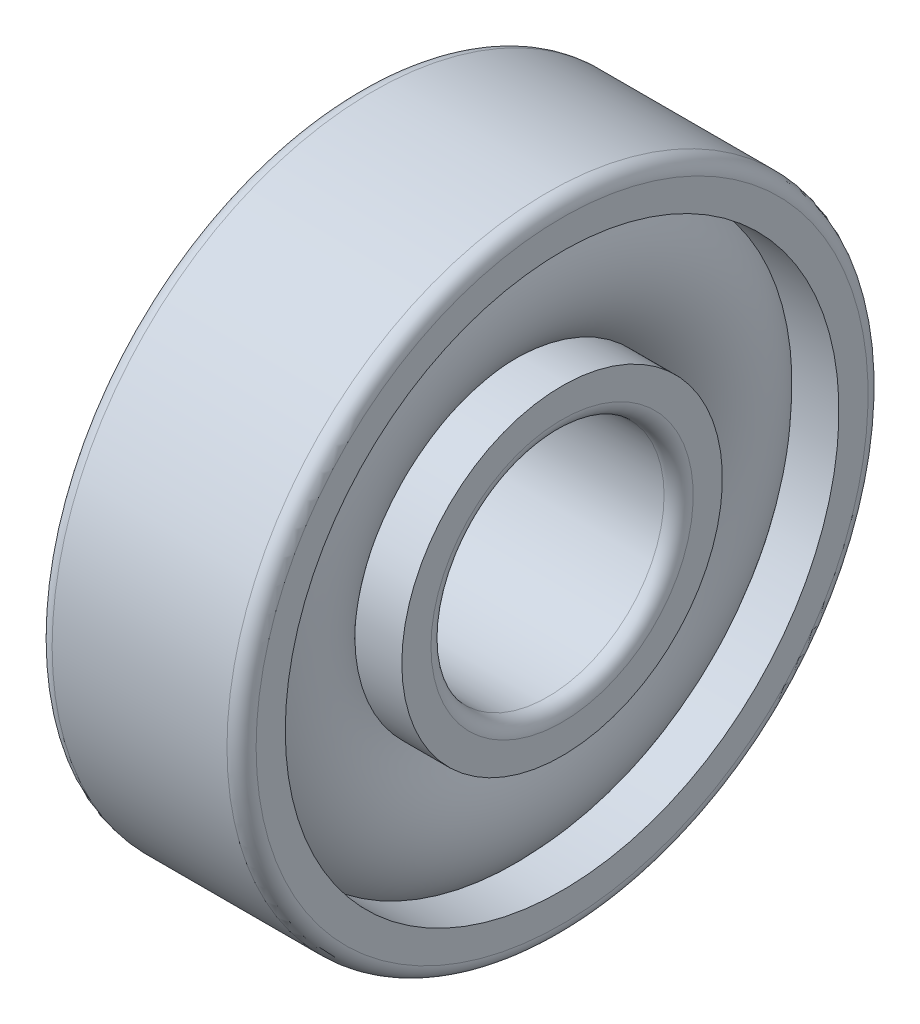
ISO-10303-21;
HEADER;
FILE_DESCRIPTION(('STEP AP214'),'2;1');
FILE_NAME('part.step','',(''),(''),'','','');
FILE_SCHEMA(('AUTOMOTIVE_DESIGN { 1 0 10303 214 1 1 1 1 }'));
ENDSEC;
DATA;
#1=APPLICATION_CONTEXT('core data for automotive mechanical design processes');
#2=APPLICATION_PROTOCOL_DEFINITION('international standard','automotive_design',2000,#1);
#3=PRODUCT_CONTEXT('',#1,'mechanical');
#4=PRODUCT('Part','Part','',(#3));
#5=PRODUCT_RELATED_PRODUCT_CATEGORY('part','',(#4));
#6=PRODUCT_DEFINITION_FORMATION('','',#4);
#7=PRODUCT_DEFINITION_CONTEXT('part definition',#1,'design');
#8=PRODUCT_DEFINITION('design','',#6,#7);
#9=PRODUCT_DEFINITION_SHAPE('','',#8);
#10=(LENGTH_UNIT() NAMED_UNIT(*) SI_UNIT(.MILLI.,.METRE.));
#11=(NAMED_UNIT(*) PLANE_ANGLE_UNIT() SI_UNIT($,.RADIAN.));
#12=(NAMED_UNIT(*) SI_UNIT($,.STERADIAN.) SOLID_ANGLE_UNIT());
#13=UNCERTAINTY_MEASURE_WITH_UNIT(LENGTH_MEASURE(1.E-05),#10,'distance_accuracy_value','');
#14=(GEOMETRIC_REPRESENTATION_CONTEXT(3) GLOBAL_UNCERTAINTY_ASSIGNED_CONTEXT((#13)) GLOBAL_UNIT_ASSIGNED_CONTEXT((#10,
#11,#12)) REPRESENTATION_CONTEXT('',''));
#15=CARTESIAN_POINT('',(0.,0.,0.));
#16=DIRECTION('',(0.,0.,1.));
#17=DIRECTION('',(1.,0.,0.));
#18=AXIS2_PLACEMENT_3D('',#15,#16,#17);
#19=CARTESIAN_POINT('',(0.,0.,0.));
#20=DIRECTION('',(-1.,0.,0.));
#21=DIRECTION('',(0.,0.,1.));
#22=AXIS2_PLACEMENT_3D('',#19,#20,#21);
#23=CYLINDRICAL_SURFACE('',#22,9.5);
#24=CARTESIAN_POINT('',(-1.88745860881769,0.,0.));
#25=DIRECTION('',(-1.,0.,0.));
#26=DIRECTION('',(0.,0.,1.));
#27=AXIS2_PLACEMENT_3D('',#24,#25,#26);
#28=CIRCLE('',#27,9.5);
#29=CARTESIAN_POINT('',(-1.88745860881769,0.,9.5));
#30=VERTEX_POINT('',#29);
#31=EDGE_CURVE('E66',#30,#30,#28,.T.);
#32=ORIENTED_EDGE('',*,*,#31,.F.);
#33=EDGE_LOOP('',(#32));
#34=FACE_BOUND('',#33,.T.);
#35=CARTESIAN_POINT('',(-3.5,0.,0.));
#36=DIRECTION('',(-1.,0.,0.));
#37=DIRECTION('',(0.,0.,1.));
#38=AXIS2_PLACEMENT_3D('',#35,#36,#37);
#39=CIRCLE('',#38,9.5);
#40=CARTESIAN_POINT('',(-3.5,0.,9.5));
#41=VERTEX_POINT('',#40);
#42=EDGE_CURVE('E87',#41,#41,#39,.T.);
#43=ORIENTED_EDGE('',*,*,#42,.T.);
#44=EDGE_LOOP('',(#43));
#45=FACE_BOUND('',#44,.T.);
#46=ADVANCED_FACE('F34',(#34,#45),#23,.F.);
#47=CARTESIAN_POINT('',(0.,0.,0.));
#48=DIRECTION('',(-1.,0.,0.));
#49=DIRECTION('',(0.,0.,1.));
#50=AXIS2_PLACEMENT_3D('',#47,#48,#49);
#51=TOROIDAL_SURFACE('',#50,7.5,2.75);
#52=CARTESIAN_POINT('',(-1.88745860881768,0.,0.));
#53=DIRECTION('',(-1.,0.,0.));
#54=DIRECTION('',(0.,0.,1.));
#55=AXIS2_PLACEMENT_3D('',#52,#53,#54);
#56=CIRCLE('',#55,5.5);
#57=CARTESIAN_POINT('',(-1.88745860881768,0.,5.5));
#58=VERTEX_POINT('',#57);
#59=EDGE_CURVE('E69',#58,#58,#56,.T.);
#60=ORIENTED_EDGE('',*,*,#59,.F.);
#61=EDGE_LOOP('',(#60));
#62=FACE_BOUND('',#61,.T.);
#63=ORIENTED_EDGE('',*,*,#31,.T.);
#64=EDGE_LOOP('',(#63));
#65=FACE_BOUND('',#64,.T.);
#66=ADVANCED_FACE('F108',(#62,#65),#51,.T.);
#67=CARTESIAN_POINT('',(0.,0.,0.));
#68=DIRECTION('',(-1.,0.,0.));
#69=DIRECTION('',(0.,0.,1.));
#70=AXIS2_PLACEMENT_3D('',#67,#68,#69);
#71=CYLINDRICAL_SURFACE('',#70,5.5);
#72=ORIENTED_EDGE('',*,*,#59,.T.);
#73=EDGE_LOOP('',(#72));
#74=FACE_BOUND('',#73,.T.);
#75=CARTESIAN_POINT('',(-3.5,0.,0.));
#76=DIRECTION('',(-1.,0.,0.));
#77=DIRECTION('',(0.,0.,1.));
#78=AXIS2_PLACEMENT_3D('',#75,#76,#77);
#79=CIRCLE('',#78,5.5);
#80=CARTESIAN_POINT('',(-3.5,0.,5.5));
#81=VERTEX_POINT('',#80);
#82=EDGE_CURVE('E72',#81,#81,#79,.T.);
#83=ORIENTED_EDGE('',*,*,#82,.F.);
#84=EDGE_LOOP('',(#83));
#85=FACE_BOUND('',#84,.T.);
#86=ADVANCED_FACE('F115',(#74,#85),#71,.T.);
#87=CARTESIAN_POINT('',(-3.5,0.,0.));
#88=DIRECTION('',(-1.,0.,0.));
#89=DIRECTION('',(0.,0.,1.));
#90=AXIS2_PLACEMENT_3D('',#87,#88,#89);
#91=PLANE('',#90);
#92=CARTESIAN_POINT('',(-3.5,0.,0.));
#93=DIRECTION('',(-1.,0.,0.));
#94=DIRECTION('',(0.,0.,1.));
#95=AXIS2_PLACEMENT_3D('',#92,#93,#94);
#96=CIRCLE('',#95,4.5);
#97=CARTESIAN_POINT('',(-3.5,0.,4.5));
#98=VERTEX_POINT('',#97);
#99=EDGE_CURVE('E57',#98,#98,#96,.F.);
#100=ORIENTED_EDGE('',*,*,#99,.T.);
#101=EDGE_LOOP('',(#100));
#102=FACE_BOUND('',#101,.T.);
#103=ORIENTED_EDGE('',*,*,#82,.T.);
#104=EDGE_LOOP('',(#103));
#105=FACE_BOUND('',#104,.T.);
#106=ADVANCED_FACE('F146',(#102,#105),#91,.T.);
#107=CARTESIAN_POINT('',(0.,0.,0.));
#108=DIRECTION('',(-1.,0.,0.));
#109=DIRECTION('',(0.,0.,1.));
#110=AXIS2_PLACEMENT_3D('',#107,#108,#109);
#111=CYLINDRICAL_SURFACE('',#110,4.);
#112=CARTESIAN_POINT('',(-3.,0.,0.));
#113=DIRECTION('',(-1.,0.,0.));
#114=DIRECTION('',(0.,0.,1.));
#115=AXIS2_PLACEMENT_3D('',#112,#113,#114);
#116=CIRCLE('',#115,4.);
#117=CARTESIAN_POINT('',(-3.,0.,4.));
#118=VERTEX_POINT('',#117);
#119=EDGE_CURVE('E60',#118,#118,#116,.T.);
#120=ORIENTED_EDGE('',*,*,#119,.T.);
#121=EDGE_LOOP('',(#120));
#122=FACE_BOUND('',#121,.T.);
#123=CARTESIAN_POINT('',(3.,0.,0.));
#124=DIRECTION('',(-1.,0.,0.));
#125=DIRECTION('',(0.,0.,1.));
#126=AXIS2_PLACEMENT_3D('',#123,#124,#125);
#127=CIRCLE('',#126,4.);
#128=CARTESIAN_POINT('',(3.,0.,4.));
#129=VERTEX_POINT('',#128);
#130=EDGE_CURVE('E63',#129,#129,#127,.F.);
#131=ORIENTED_EDGE('',*,*,#130,.T.);
#132=EDGE_LOOP('',(#131));
#133=FACE_BOUND('',#132,.T.);
#134=ADVANCED_FACE('F142',(#122,#133),#111,.F.);
#135=CARTESIAN_POINT('',(3.5,0.,0.));
#136=DIRECTION('',(-1.,0.,0.));
#137=DIRECTION('',(0.,0.,1.));
#138=AXIS2_PLACEMENT_3D('',#135,#136,#137);
#139=PLANE('',#138);
#140=CARTESIAN_POINT('',(3.5,0.,0.));
#141=DIRECTION('',(-1.,0.,0.));
#142=DIRECTION('',(0.,0.,1.));
#143=AXIS2_PLACEMENT_3D('',#140,#141,#142);
#144=CIRCLE('',#143,4.5);
#145=CARTESIAN_POINT('',(3.5,0.,4.5));
#146=VERTEX_POINT('',#145);
#147=EDGE_CURVE('E54',#146,#146,#144,.T.);
#148=ORIENTED_EDGE('',*,*,#147,.T.);
#149=EDGE_LOOP('',(#148));
#150=FACE_BOUND('',#149,.T.);
#151=CARTESIAN_POINT('',(3.5,0.,0.));
#152=DIRECTION('',(-1.,0.,0.));
#153=DIRECTION('',(0.,0.,1.));
#154=AXIS2_PLACEMENT_3D('',#151,#152,#153);
#155=CIRCLE('',#154,5.5);
#156=CARTESIAN_POINT('',(3.5,0.,5.5));
#157=VERTEX_POINT('',#156);
#158=EDGE_CURVE('E75',#157,#157,#155,.T.);
#159=ORIENTED_EDGE('',*,*,#158,.F.);
#160=EDGE_LOOP('',(#159));
#161=FACE_BOUND('',#160,.T.);
#162=ADVANCED_FACE('F136',(#150,#161),#139,.F.);
#163=ORIENTED_EDGE('',*,*,#158,.T.);
#164=EDGE_LOOP('',(#163));
#165=FACE_BOUND('',#164,.T.);
#166=CARTESIAN_POINT('',(1.88745860881769,0.,0.));
#167=DIRECTION('',(-1.,0.,0.));
#168=DIRECTION('',(0.,0.,1.));
#169=AXIS2_PLACEMENT_3D('',#166,#167,#168);
#170=CIRCLE('',#169,5.5);
#171=CARTESIAN_POINT('',(1.88745860881769,0.,5.5));
#172=VERTEX_POINT('',#171);
#173=EDGE_CURVE('E78',#172,#172,#170,.T.);
#174=ORIENTED_EDGE('',*,*,#173,.F.);
#175=EDGE_LOOP('',(#174));
#176=FACE_BOUND('',#175,.T.);
#177=ADVANCED_FACE('F127',(#165,#176),#71,.T.);
#178=CARTESIAN_POINT('',(1.88745860881769,0.,0.));
#179=DIRECTION('',(-1.,0.,0.));
#180=DIRECTION('',(0.,0.,1.));
#181=AXIS2_PLACEMENT_3D('',#178,#179,#180);
#182=CIRCLE('',#181,9.5);
#183=CARTESIAN_POINT('',(1.88745860881769,0.,9.5));
#184=VERTEX_POINT('',#183);
#185=EDGE_CURVE('E81',#184,#184,#182,.T.);
#186=ORIENTED_EDGE('',*,*,#185,.F.);
#187=EDGE_LOOP('',(#186));
#188=FACE_BOUND('',#187,.T.);
#189=ORIENTED_EDGE('',*,*,#173,.T.);
#190=EDGE_LOOP('',(#189));
#191=FACE_BOUND('',#190,.T.);
#192=ADVANCED_FACE('F118',(#188,#191),#51,.T.);
#193=CARTESIAN_POINT('',(3.5,0.,0.));
#194=DIRECTION('',(-1.,0.,0.));
#195=DIRECTION('',(0.,0.,1.));
#196=AXIS2_PLACEMENT_3D('',#193,#194,#195);
#197=CIRCLE('',#196,9.5);
#198=CARTESIAN_POINT('',(3.5,0.,9.5));
#199=VERTEX_POINT('',#198);
#200=EDGE_CURVE('E84',#199,#199,#197,.T.);
#201=ORIENTED_EDGE('',*,*,#200,.F.);
#202=EDGE_LOOP('',(#201));
#203=FACE_BOUND('',#202,.T.);
#204=ORIENTED_EDGE('',*,*,#185,.T.);
#205=EDGE_LOOP('',(#204));
#206=FACE_BOUND('',#205,.T.);
#207=ADVANCED_FACE('F111',(#203,#206),#23,.F.);
#208=CARTESIAN_POINT('',(3.5,0.,0.));
#209=DIRECTION('',(-1.,0.,0.));
#210=DIRECTION('',(0.,0.,1.));
#211=AXIS2_PLACEMENT_3D('',#208,#209,#210);
#212=PLANE('',#211);
#213=CARTESIAN_POINT('',(3.5,0.,0.));
#214=DIRECTION('',(-1.,0.,0.));
#215=DIRECTION('',(0.,0.,1.));
#216=AXIS2_PLACEMENT_3D('',#213,#214,#215);
#217=CIRCLE('',#216,10.5);
#218=CARTESIAN_POINT('',(3.5,0.,10.5));
#219=VERTEX_POINT('',#218);
#220=EDGE_CURVE('E10',#219,#219,#217,.F.);
#221=ORIENTED_EDGE('',*,*,#220,.T.);
#222=EDGE_LOOP('',(#221));
#223=FACE_BOUND('',#222,.T.);
#224=ORIENTED_EDGE('',*,*,#200,.T.);
#225=EDGE_LOOP('',(#224));
#226=FACE_BOUND('',#225,.T.);
#227=ADVANCED_FACE('F105',(#223,#226),#212,.F.);
#228=CARTESIAN_POINT('',(0.,0.,0.));
#229=DIRECTION('',(-1.,0.,0.));
#230=DIRECTION('',(0.,0.,1.));
#231=AXIS2_PLACEMENT_3D('',#228,#229,#230);
#232=CYLINDRICAL_SURFACE('',#231,11.);
#233=CARTESIAN_POINT('',(-3.,0.,0.));
#234=DIRECTION('',(-1.,0.,0.));
#235=DIRECTION('',(0.,0.,1.));
#236=AXIS2_PLACEMENT_3D('',#233,#234,#235);
#237=CIRCLE('',#236,11.);
#238=CARTESIAN_POINT('',(-3.,0.,11.));
#239=VERTEX_POINT('',#238);
#240=EDGE_CURVE('E41',#239,#239,#237,.F.);
#241=ORIENTED_EDGE('',*,*,#240,.T.);
#242=EDGE_LOOP('',(#241));
#243=FACE_BOUND('',#242,.T.);
#244=CARTESIAN_POINT('',(3.,0.,0.));
#245=DIRECTION('',(-1.,0.,0.));
#246=DIRECTION('',(0.,0.,1.));
#247=AXIS2_PLACEMENT_3D('',#244,#245,#246);
#248=CIRCLE('',#247,11.);
#249=CARTESIAN_POINT('',(3.,0.,11.));
#250=VERTEX_POINT('',#249);
#251=EDGE_CURVE('E45',#250,#250,#248,.T.);
#252=ORIENTED_EDGE('',*,*,#251,.T.);
#253=EDGE_LOOP('',(#252));
#254=FACE_BOUND('',#253,.T.);
#255=ADVANCED_FACE('F95',(#243,#254),#232,.T.);
#256=CARTESIAN_POINT('',(-3.5,0.,0.));
#257=DIRECTION('',(-1.,0.,0.));
#258=DIRECTION('',(0.,0.,1.));
#259=AXIS2_PLACEMENT_3D('',#256,#257,#258);
#260=PLANE('',#259);
#261=CARTESIAN_POINT('',(-3.5,0.,0.));
#262=DIRECTION('',(-1.,0.,0.));
#263=DIRECTION('',(0.,0.,1.));
#264=AXIS2_PLACEMENT_3D('',#261,#262,#263);
#265=CIRCLE('',#264,10.5);
#266=CARTESIAN_POINT('',(-3.5,0.,10.5));
#267=VERTEX_POINT('',#266);
#268=EDGE_CURVE('E49',#267,#267,#265,.T.);
#269=ORIENTED_EDGE('',*,*,#268,.T.);
#270=EDGE_LOOP('',(#269));
#271=FACE_BOUND('',#270,.T.);
#272=ORIENTED_EDGE('',*,*,#42,.F.);
#273=EDGE_LOOP('',(#272));
#274=FACE_BOUND('',#273,.T.);
#275=ADVANCED_FACE('F92',(#271,#274),#260,.T.);
#276=CARTESIAN_POINT('',(-3.,0.,0.));
#277=DIRECTION('',(-1.,0.,0.));
#278=DIRECTION('',(0.,0.,1.));
#279=AXIS2_PLACEMENT_3D('',#276,#277,#278);
#280=TOROIDAL_SURFACE('',#279,4.5,0.5);
#281=ORIENTED_EDGE('',*,*,#99,.F.);
#282=EDGE_LOOP('',(#281));
#283=FACE_BOUND('',#282,.T.);
#284=ORIENTED_EDGE('',*,*,#119,.F.);
#285=EDGE_LOOP('',(#284));
#286=FACE_BOUND('',#285,.T.);
#287=ADVANCED_FACE('F94',(#283,#286),#280,.T.);
#288=CARTESIAN_POINT('',(3.,0.,0.));
#289=DIRECTION('',(-1.,0.,0.));
#290=DIRECTION('',(0.,0.,1.));
#291=AXIS2_PLACEMENT_3D('',#288,#289,#290);
#292=TOROIDAL_SURFACE('',#291,4.5,0.5);
#293=ORIENTED_EDGE('',*,*,#130,.F.);
#294=EDGE_LOOP('',(#293));
#295=FACE_BOUND('',#294,.T.);
#296=ORIENTED_EDGE('',*,*,#147,.F.);
#297=EDGE_LOOP('',(#296));
#298=FACE_BOUND('',#297,.T.);
#299=ADVANCED_FACE('F102',(#295,#298),#292,.T.);
#300=CARTESIAN_POINT('',(-3.,0.,0.));
#301=DIRECTION('',(-1.,0.,0.));
#302=DIRECTION('',(0.,0.,1.));
#303=AXIS2_PLACEMENT_3D('',#300,#301,#302);
#304=TOROIDAL_SURFACE('',#303,10.5,0.5);
#305=ORIENTED_EDGE('',*,*,#240,.F.);
#306=EDGE_LOOP('',(#305));
#307=FACE_BOUND('',#306,.T.);
#308=ORIENTED_EDGE('',*,*,#268,.F.);
#309=EDGE_LOOP('',(#308));
#310=FACE_BOUND('',#309,.T.);
#311=ADVANCED_FACE('F165',(#307,#310),#304,.T.);
#312=CARTESIAN_POINT('',(3.,0.,0.));
#313=DIRECTION('',(-1.,0.,0.));
#314=DIRECTION('',(0.,0.,1.));
#315=AXIS2_PLACEMENT_3D('',#312,#313,#314);
#316=TOROIDAL_SURFACE('',#315,10.5,0.5);
#317=ORIENTED_EDGE('',*,*,#220,.F.);
#318=EDGE_LOOP('',(#317));
#319=FACE_BOUND('',#318,.T.);
#320=ORIENTED_EDGE('',*,*,#251,.F.);
#321=EDGE_LOOP('',(#320));
#322=FACE_BOUND('',#321,.T.);
#323=ADVANCED_FACE('F36',(#319,#322),#316,.T.);
#324=CLOSED_SHELL('',(#46,#66,#86,#106,#134,#162,#177,#192,#207,#227,#255,#275,#287,#299,#311,#323));
#325=MANIFOLD_SOLID_BREP('B2',#324);
#326=ADVANCED_BREP_SHAPE_REPRESENTATION('',(#18,#325),#14);
#327=SHAPE_DEFINITION_REPRESENTATION(#9,#326);
ENDSEC;
END-ISO-10303-21;
